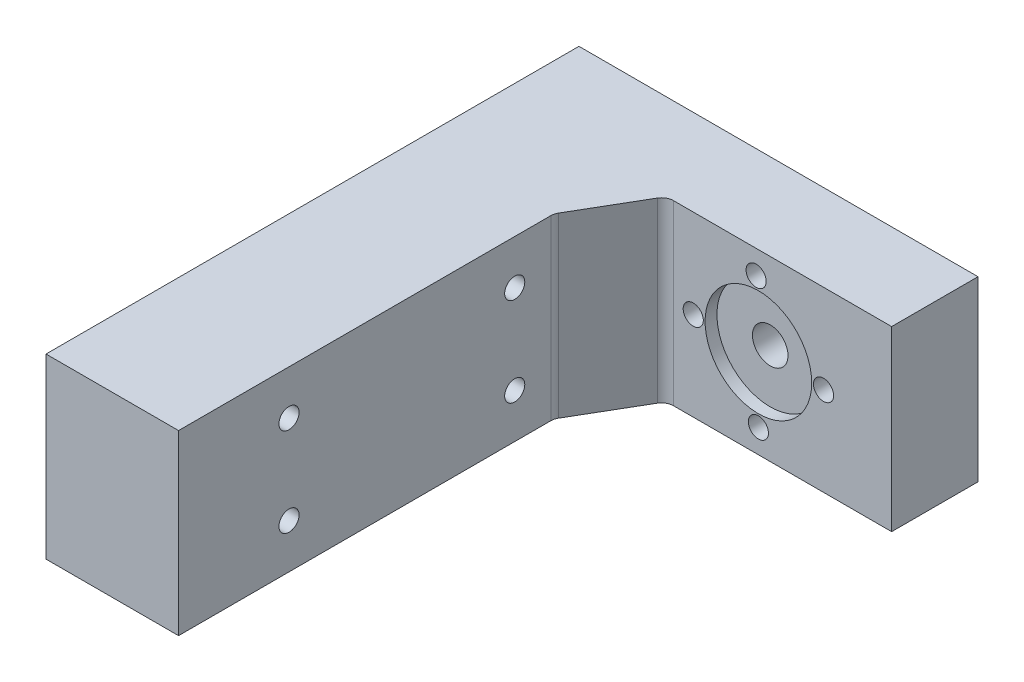
ISO-10303-21;
HEADER;
FILE_DESCRIPTION(('STEP AP214'),'2;1');
FILE_NAME('part.step','',(''),(''),'','','');
FILE_SCHEMA(('AUTOMOTIVE_DESIGN { 1 0 10303 214 1 1 1 1 }'));
ENDSEC;
DATA;
#1=APPLICATION_CONTEXT('core data for automotive mechanical design processes');
#2=APPLICATION_PROTOCOL_DEFINITION('international standard','automotive_design',2000,#1);
#3=PRODUCT_CONTEXT('',#1,'mechanical');
#4=PRODUCT('Part','Part','',(#3));
#5=PRODUCT_RELATED_PRODUCT_CATEGORY('part','',(#4));
#6=PRODUCT_DEFINITION_FORMATION('','',#4);
#7=PRODUCT_DEFINITION_CONTEXT('part definition',#1,'design');
#8=PRODUCT_DEFINITION('design','',#6,#7);
#9=PRODUCT_DEFINITION_SHAPE('','',#8);
#10=(LENGTH_UNIT() NAMED_UNIT(*) SI_UNIT(.MILLI.,.METRE.));
#11=(NAMED_UNIT(*) PLANE_ANGLE_UNIT() SI_UNIT($,.RADIAN.));
#12=(NAMED_UNIT(*) SI_UNIT($,.STERADIAN.) SOLID_ANGLE_UNIT());
#13=UNCERTAINTY_MEASURE_WITH_UNIT(LENGTH_MEASURE(1.E-05),#10,'distance_accuracy_value','');
#14=(GEOMETRIC_REPRESENTATION_CONTEXT(3) GLOBAL_UNCERTAINTY_ASSIGNED_CONTEXT((#13)) GLOBAL_UNIT_ASSIGNED_CONTEXT((#10,
#11,#12)) REPRESENTATION_CONTEXT('',''));
#15=CARTESIAN_POINT('',(0.,0.,0.));
#16=DIRECTION('',(0.,0.,1.));
#17=DIRECTION('',(1.,0.,0.));
#18=AXIS2_PLACEMENT_3D('',#15,#16,#17);
#19=CARTESIAN_POINT('',(-225.,150.,0.));
#20=DIRECTION('',(0.,0.,1.));
#21=DIRECTION('',(1.,0.,0.));
#22=AXIS2_PLACEMENT_3D('',#19,#20,#21);
#23=CYLINDRICAL_SURFACE('',#22,30.);
#24=CARTESIAN_POINT('',(-225.,150.,0.));
#25=DIRECTION('',(0.,0.,1.));
#26=DIRECTION('',(1.,0.,0.));
#27=AXIS2_PLACEMENT_3D('',#24,#25,#26);
#28=CIRCLE('',#27,30.);
#29=CARTESIAN_POINT('',(-195.,150.,0.));
#30=VERTEX_POINT('',#29);
#31=EDGE_CURVE('E231',#30,#30,#28,.T.);
#32=ORIENTED_EDGE('',*,*,#31,.F.);
#33=EDGE_LOOP('',(#32));
#34=FACE_BOUND('',#33,.T.);
#35=CARTESIAN_POINT('',(-225.,150.,125.843324446959));
#36=DIRECTION('',(0.,0.,1.));
#37=DIRECTION('',(1.,0.,0.));
#38=AXIS2_PLACEMENT_3D('',#35,#36,#37);
#39=CIRCLE('',#38,30.);
#40=CARTESIAN_POINT('',(-195.,150.,125.843324446959));
#41=VERTEX_POINT('',#40);
#42=EDGE_CURVE('E229',#41,#41,#39,.F.);
#43=ORIENTED_EDGE('',*,*,#42,.F.);
#44=EDGE_LOOP('',(#43));
#45=FACE_BOUND('',#44,.T.);
#46=ADVANCED_FACE('F119',(#34,#45),#23,.F.);
#47=CARTESIAN_POINT('',(0.,300.,145.843324446959));
#48=DIRECTION('',(-1.,0.,0.));
#49=DIRECTION('',(0.,0.,1.));
#50=AXIS2_PLACEMENT_3D('',#47,#48,#49);
#51=PLANE('',#50);
#52=DIRECTION('',(0.,0.,-1.));
#53=VECTOR('',#52,1.);
#54=CARTESIAN_POINT('',(0.,0.,145.843324446959));
#55=LINE('',#54,#53);
#56=CARTESIAN_POINT('',(0.,0.,145.843324446959));
#57=VERTEX_POINT('',#56);
#58=CARTESIAN_POINT('',(0.,0.,0.));
#59=VERTEX_POINT('',#58);
#60=EDGE_CURVE('E219',#57,#59,#55,.T.);
#61=ORIENTED_EDGE('',*,*,#60,.T.);
#62=DIRECTION('',(0.,-1.,0.));
#63=VECTOR('',#62,1.);
#64=CARTESIAN_POINT('',(0.,300.,0.));
#65=LINE('',#64,#63);
#66=CARTESIAN_POINT('',(0.,300.,0.));
#67=VERTEX_POINT('',#66);
#68=EDGE_CURVE('E196',#67,#59,#65,.T.);
#69=ORIENTED_EDGE('',*,*,#68,.F.);
#70=DIRECTION('',(0.,0.,-1.));
#71=VECTOR('',#70,1.);
#72=CARTESIAN_POINT('',(0.,300.,145.843324446959));
#73=LINE('',#72,#71);
#74=CARTESIAN_POINT('',(0.,300.,145.843324446959));
#75=VERTEX_POINT('',#74);
#76=EDGE_CURVE('E203',#75,#67,#73,.T.);
#77=ORIENTED_EDGE('',*,*,#76,.F.);
#78=DIRECTION('',(0.,-1.,0.));
#79=VECTOR('',#78,1.);
#80=CARTESIAN_POINT('',(0.,300.,145.843324446959));
#81=LINE('',#80,#79);
#82=EDGE_CURVE('E283',#75,#57,#81,.T.);
#83=ORIENTED_EDGE('',*,*,#82,.T.);
#84=EDGE_LOOP('',(#61,#69,#77,#83));
#85=FACE_BOUND('',#84,.T.);
#86=ADVANCED_FACE('F216',(#85),#51,.F.);
#87=CARTESIAN_POINT('',(0.,300.,0.));
#88=DIRECTION('',(0.,0.,1.));
#89=DIRECTION('',(1.,0.,0.));
#90=AXIS2_PLACEMENT_3D('',#87,#88,#89);
#91=PLANE('',#90);
#92=CARTESIAN_POINT('',(-335.,150.,0.));
#93=DIRECTION('',(0.,0.,1.));
#94=DIRECTION('',(1.,0.,0.));
#95=AXIS2_PLACEMENT_3D('',#92,#93,#94);
#96=CIRCLE('',#95,17.);
#97=CARTESIAN_POINT('',(-318.,150.,0.));
#98=VERTEX_POINT('',#97);
#99=EDGE_CURVE('E304',#98,#98,#96,.T.);
#100=ORIENTED_EDGE('',*,*,#99,.T.);
#101=EDGE_LOOP('',(#100));
#102=FACE_BOUND('',#101,.T.);
#103=ORIENTED_EDGE('',*,*,#31,.T.);
#104=EDGE_LOOP('',(#103));
#105=FACE_BOUND('',#104,.T.);
#106=CARTESIAN_POINT('',(-225.,40.,0.));
#107=DIRECTION('',(0.,0.,1.));
#108=DIRECTION('',(1.,0.,0.));
#109=AXIS2_PLACEMENT_3D('',#106,#107,#108);
#110=CIRCLE('',#109,17.);
#111=CARTESIAN_POINT('',(-208.,40.,0.));
#112=VERTEX_POINT('',#111);
#113=EDGE_CURVE('E332',#112,#112,#110,.T.);
#114=ORIENTED_EDGE('',*,*,#113,.T.);
#115=EDGE_LOOP('',(#114));
#116=FACE_BOUND('',#115,.T.);
#117=CARTESIAN_POINT('',(-115.,150.,0.));
#118=DIRECTION('',(0.,0.,1.));
#119=DIRECTION('',(1.,0.,0.));
#120=AXIS2_PLACEMENT_3D('',#117,#118,#119);
#121=CIRCLE('',#120,17.);
#122=CARTESIAN_POINT('',(-98.,150.,0.));
#123=VERTEX_POINT('',#122);
#124=EDGE_CURVE('E313',#123,#123,#121,.T.);
#125=ORIENTED_EDGE('',*,*,#124,.T.);
#126=EDGE_LOOP('',(#125));
#127=FACE_BOUND('',#126,.T.);
#128=CARTESIAN_POINT('',(-228.822978678295,259.933547354869,0.));
#129=DIRECTION('',(0.,0.,1.));
#130=DIRECTION('',(1.,0.,0.));
#131=AXIS2_PLACEMENT_3D('',#128,#129,#130);
#132=CIRCLE('',#131,17.);
#133=CARTESIAN_POINT('',(-211.822978678295,259.933547354869,0.));
#134=VERTEX_POINT('',#133);
#135=EDGE_CURVE('E324',#134,#134,#132,.T.);
#136=ORIENTED_EDGE('',*,*,#135,.T.);
#137=EDGE_LOOP('',(#136));
#138=FACE_BOUND('',#137,.T.);
#139=DIRECTION('',(-1.,0.,0.));
#140=VECTOR('',#139,1.);
#141=CARTESIAN_POINT('',(0.,0.,0.));
#142=LINE('',#141,#140);
#143=CARTESIAN_POINT('',(-673.85334867981,0.,0.));
#144=VERTEX_POINT('',#143);
#145=EDGE_CURVE('E296',#59,#144,#142,.T.);
#146=ORIENTED_EDGE('',*,*,#145,.T.);
#147=DIRECTION('',(0.,-1.,0.));
#148=VECTOR('',#147,1.);
#149=CARTESIAN_POINT('',(-673.85334867981,300.,0.));
#150=LINE('',#149,#148);
#151=CARTESIAN_POINT('',(-673.85334867981,300.,0.));
#152=VERTEX_POINT('',#151);
#153=EDGE_CURVE('E198',#152,#144,#150,.T.);
#154=ORIENTED_EDGE('',*,*,#153,.F.);
#155=DIRECTION('',(-1.,0.,0.));
#156=VECTOR('',#155,1.);
#157=CARTESIAN_POINT('',(0.,300.,0.));
#158=LINE('',#157,#156);
#159=EDGE_CURVE('E195',#67,#152,#158,.T.);
#160=ORIENTED_EDGE('',*,*,#159,.F.);
#161=ORIENTED_EDGE('',*,*,#68,.T.);
#162=EDGE_LOOP('',(#146,#154,#160,#161));
#163=FACE_BOUND('',#162,.T.);
#164=ADVANCED_FACE('F191',(#102,#105,#116,#127,#138,#163),#91,.F.);
#165=CARTESIAN_POINT('',(-673.85334867981,300.,0.));
#166=DIRECTION('',(1.,0.,0.));
#167=DIRECTION('',(0.,0.,-1.));
#168=AXIS2_PLACEMENT_3D('',#165,#166,#167);
#169=PLANE('',#168);
#170=CARTESIAN_POINT('',(-673.85334867981,225.,713.5));
#171=DIRECTION('',(1.,0.,0.));
#172=DIRECTION('',(0.,0.,-1.));
#173=AXIS2_PLACEMENT_3D('',#170,#171,#172);
#174=CIRCLE('',#173,17.);
#175=CARTESIAN_POINT('',(-673.85334867981,225.,696.5));
#176=VERTEX_POINT('',#175);
#177=EDGE_CURVE('E373',#176,#176,#174,.T.);
#178=ORIENTED_EDGE('',*,*,#177,.T.);
#179=EDGE_LOOP('',(#178));
#180=FACE_BOUND('',#179,.T.);
#181=CARTESIAN_POINT('',(-673.85334867981,75.,332.343324446959));
#182=DIRECTION('',(1.,0.,0.));
#183=DIRECTION('',(0.,0.,-1.));
#184=AXIS2_PLACEMENT_3D('',#181,#182,#183);
#185=CIRCLE('',#184,17.);
#186=CARTESIAN_POINT('',(-673.85334867981,75.,315.343324446959));
#187=VERTEX_POINT('',#186);
#188=EDGE_CURVE('E364',#187,#187,#185,.T.);
#189=ORIENTED_EDGE('',*,*,#188,.T.);
#190=EDGE_LOOP('',(#189));
#191=FACE_BOUND('',#190,.T.);
#192=CARTESIAN_POINT('',(-673.85334867981,225.,332.343324446959));
#193=DIRECTION('',(1.,0.,0.));
#194=DIRECTION('',(0.,0.,-1.));
#195=AXIS2_PLACEMENT_3D('',#192,#193,#194);
#196=CIRCLE('',#195,17.);
#197=CARTESIAN_POINT('',(-673.85334867981,225.,315.343324446959));
#198=VERTEX_POINT('',#197);
#199=EDGE_CURVE('E379',#198,#198,#196,.T.);
#200=ORIENTED_EDGE('',*,*,#199,.T.);
#201=EDGE_LOOP('',(#200));
#202=FACE_BOUND('',#201,.T.);
#203=CARTESIAN_POINT('',(-673.85334867981,75.,713.5));
#204=DIRECTION('',(1.,0.,0.));
#205=DIRECTION('',(0.,0.,-1.));
#206=AXIS2_PLACEMENT_3D('',#203,#204,#205);
#207=CIRCLE('',#206,17.);
#208=CARTESIAN_POINT('',(-673.85334867981,75.,696.5));
#209=VERTEX_POINT('',#208);
#210=EDGE_CURVE('E351',#209,#209,#207,.T.);
#211=ORIENTED_EDGE('',*,*,#210,.T.);
#212=EDGE_LOOP('',(#211));
#213=FACE_BOUND('',#212,.T.);
#214=DIRECTION('',(0.,0.,1.));
#215=VECTOR('',#214,1.);
#216=CARTESIAN_POINT('',(-673.85334867981,0.,0.));
#217=LINE('',#216,#215);
#218=CARTESIAN_POINT('',(-673.85334867981,0.,900.));
#219=VERTEX_POINT('',#218);
#220=EDGE_CURVE('E278',#144,#219,#217,.T.);
#221=ORIENTED_EDGE('',*,*,#220,.T.);
#222=DIRECTION('',(0.,-1.,0.));
#223=VECTOR('',#222,1.);
#224=CARTESIAN_POINT('',(-673.85334867981,300.,900.));
#225=LINE('',#224,#223);
#226=CARTESIAN_POINT('',(-673.85334867981,300.,900.));
#227=VERTEX_POINT('',#226);
#228=EDGE_CURVE('E228',#227,#219,#225,.T.);
#229=ORIENTED_EDGE('',*,*,#228,.F.);
#230=DIRECTION('',(0.,0.,1.));
#231=VECTOR('',#230,1.);
#232=CARTESIAN_POINT('',(-673.85334867981,300.,0.));
#233=LINE('',#232,#231);
#234=EDGE_CURVE('E205',#152,#227,#233,.T.);
#235=ORIENTED_EDGE('',*,*,#234,.F.);
#236=ORIENTED_EDGE('',*,*,#153,.T.);
#237=EDGE_LOOP('',(#221,#229,#235,#236));
#238=FACE_BOUND('',#237,.T.);
#239=ADVANCED_FACE('F449',(#180,#191,#202,#213,#238),#169,.F.);
#240=CARTESIAN_POINT('',(-673.85334867981,300.,900.));
#241=DIRECTION('',(0.,0.,-1.));
#242=DIRECTION('',(-1.,0.,0.));
#243=AXIS2_PLACEMENT_3D('',#240,#241,#242);
#244=PLANE('',#243);
#245=DIRECTION('',(1.,0.,0.));
#246=VECTOR('',#245,1.);
#247=CARTESIAN_POINT('',(-673.85334867981,0.,900.));
#248=LINE('',#247,#246);
#249=CARTESIAN_POINT('',(-450.,0.,900.));
#250=VERTEX_POINT('',#249);
#251=EDGE_CURVE('E273',#219,#250,#248,.T.);
#252=ORIENTED_EDGE('',*,*,#251,.T.);
#253=DIRECTION('',(0.,-1.,0.));
#254=VECTOR('',#253,1.);
#255=CARTESIAN_POINT('',(-450.,300.,900.));
#256=LINE('',#255,#254);
#257=CARTESIAN_POINT('',(-450.,300.,900.));
#258=VERTEX_POINT('',#257);
#259=EDGE_CURVE('E275',#258,#250,#256,.T.);
#260=ORIENTED_EDGE('',*,*,#259,.F.);
#261=DIRECTION('',(1.,0.,0.));
#262=VECTOR('',#261,1.);
#263=CARTESIAN_POINT('',(-673.85334867981,300.,900.));
#264=LINE('',#263,#262);
#265=EDGE_CURVE('E295',#227,#258,#264,.T.);
#266=ORIENTED_EDGE('',*,*,#265,.F.);
#267=ORIENTED_EDGE('',*,*,#228,.T.);
#268=EDGE_LOOP('',(#252,#260,#266,#267));
#269=FACE_BOUND('',#268,.T.);
#270=ADVANCED_FACE('F291',(#269),#244,.F.);
#271=CARTESIAN_POINT('',(-450.,300.,900.));
#272=DIRECTION('',(-1.,0.,0.));
#273=DIRECTION('',(0.,0.,1.));
#274=AXIS2_PLACEMENT_3D('',#271,#272,#273);
#275=PLANE('',#274);
#276=CARTESIAN_POINT('',(-450.,225.,713.5));
#277=DIRECTION('',(1.,0.,0.));
#278=DIRECTION('',(0.,0.,-1.));
#279=AXIS2_PLACEMENT_3D('',#276,#277,#278);
#280=CIRCLE('',#279,17.);
#281=CARTESIAN_POINT('',(-450.,225.,696.5));
#282=VERTEX_POINT('',#281);
#283=EDGE_CURVE('E359',#282,#282,#280,.T.);
#284=ORIENTED_EDGE('',*,*,#283,.F.);
#285=EDGE_LOOP('',(#284));
#286=FACE_BOUND('',#285,.T.);
#287=CARTESIAN_POINT('',(-450.,75.,332.343324446959));
#288=DIRECTION('',(1.,0.,0.));
#289=DIRECTION('',(0.,0.,-1.));
#290=AXIS2_PLACEMENT_3D('',#287,#288,#289);
#291=CIRCLE('',#290,17.);
#292=CARTESIAN_POINT('',(-450.,75.,315.343324446959));
#293=VERTEX_POINT('',#292);
#294=EDGE_CURVE('E368',#293,#293,#291,.T.);
#295=ORIENTED_EDGE('',*,*,#294,.F.);
#296=EDGE_LOOP('',(#295));
#297=FACE_BOUND('',#296,.T.);
#298=CARTESIAN_POINT('',(-450.,225.,332.343324446959));
#299=DIRECTION('',(1.,0.,0.));
#300=DIRECTION('',(0.,0.,-1.));
#301=AXIS2_PLACEMENT_3D('',#298,#299,#300);
#302=CIRCLE('',#301,17.);
#303=CARTESIAN_POINT('',(-450.,225.,315.343324446959));
#304=VERTEX_POINT('',#303);
#305=EDGE_CURVE('E367',#304,#304,#302,.T.);
#306=ORIENTED_EDGE('',*,*,#305,.F.);
#307=EDGE_LOOP('',(#306));
#308=FACE_BOUND('',#307,.T.);
#309=CARTESIAN_POINT('',(-450.,75.,713.5));
#310=DIRECTION('',(1.,0.,0.));
#311=DIRECTION('',(0.,0.,-1.));
#312=AXIS2_PLACEMENT_3D('',#309,#310,#311);
#313=CIRCLE('',#312,17.);
#314=CARTESIAN_POINT('',(-450.,75.,696.5));
#315=VERTEX_POINT('',#314);
#316=EDGE_CURVE('E358',#315,#315,#313,.T.);
#317=ORIENTED_EDGE('',*,*,#316,.F.);
#318=EDGE_LOOP('',(#317));
#319=FACE_BOUND('',#318,.T.);
#320=DIRECTION('',(0.,0.,-1.));
#321=VECTOR('',#320,1.);
#322=CARTESIAN_POINT('',(-450.,0.,900.));
#323=LINE('',#322,#321);
#324=CARTESIAN_POINT('',(-450.,0.,271.250307273959));
#325=VERTEX_POINT('',#324);
#326=EDGE_CURVE('E267',#250,#325,#323,.T.);
#327=ORIENTED_EDGE('',*,*,#326,.T.);
#328=DIRECTION('',(0.,-1.,0.));
#329=VECTOR('',#328,1.);
#330=CARTESIAN_POINT('',(-450.,300.,271.250307273959));
#331=LINE('',#330,#329);
#332=CARTESIAN_POINT('',(-450.,300.,271.250307273959));
#333=VERTEX_POINT('',#332);
#334=EDGE_CURVE('E248',#325,#333,#331,.F.);
#335=ORIENTED_EDGE('',*,*,#334,.T.);
#336=DIRECTION('',(0.,0.,-1.));
#337=VECTOR('',#336,1.);
#338=CARTESIAN_POINT('',(-450.,300.,900.));
#339=LINE('',#338,#337);
#340=EDGE_CURVE('E262',#258,#333,#339,.T.);
#341=ORIENTED_EDGE('',*,*,#340,.F.);
#342=ORIENTED_EDGE('',*,*,#259,.T.);
#343=EDGE_LOOP('',(#327,#335,#341,#342));
#344=FACE_BOUND('',#343,.T.);
#345=ADVANCED_FACE('F270',(#286,#297,#308,#319,#344),#275,.F.);
#346=CARTESIAN_POINT('',(-450.,300.,145.843324446959));
#347=DIRECTION('',(0.,0.,-1.));
#348=DIRECTION('',(-1.,0.,0.));
#349=AXIS2_PLACEMENT_3D('',#346,#347,#348);
#350=PLANE('',#349);
#351=CARTESIAN_POINT('',(-225.,150.,145.843324446959));
#352=DIRECTION('',(0.,0.,1.));
#353=DIRECTION('',(1.,0.,0.));
#354=AXIS2_PLACEMENT_3D('',#351,#352,#353);
#355=CIRCLE('',#354,90.);
#356=CARTESIAN_POINT('',(-135.,150.,145.843324446959));
#357=VERTEX_POINT('',#356);
#358=EDGE_CURVE('E349',#357,#357,#355,.T.);
#359=ORIENTED_EDGE('',*,*,#358,.F.);
#360=EDGE_LOOP('',(#359));
#361=FACE_BOUND('',#360,.T.);
#362=CARTESIAN_POINT('',(-335.,150.,145.843324446959));
#363=DIRECTION('',(0.,0.,1.));
#364=DIRECTION('',(1.,0.,0.));
#365=AXIS2_PLACEMENT_3D('',#362,#363,#364);
#366=CIRCLE('',#365,17.);
#367=CARTESIAN_POINT('',(-318.,150.,145.843324446959));
#368=VERTEX_POINT('',#367);
#369=EDGE_CURVE('E334',#368,#368,#366,.T.);
#370=ORIENTED_EDGE('',*,*,#369,.F.);
#371=EDGE_LOOP('',(#370));
#372=FACE_BOUND('',#371,.T.);
#373=CARTESIAN_POINT('',(-225.,40.,145.843324446959));
#374=DIRECTION('',(0.,0.,1.));
#375=DIRECTION('',(1.,0.,0.));
#376=AXIS2_PLACEMENT_3D('',#373,#374,#375);
#377=CIRCLE('',#376,17.);
#378=CARTESIAN_POINT('',(-208.,40.,145.843324446959));
#379=VERTEX_POINT('',#378);
#380=EDGE_CURVE('E316',#379,#379,#377,.T.);
#381=ORIENTED_EDGE('',*,*,#380,.F.);
#382=EDGE_LOOP('',(#381));
#383=FACE_BOUND('',#382,.T.);
#384=CARTESIAN_POINT('',(-115.,150.,145.843324446959));
#385=DIRECTION('',(0.,0.,1.));
#386=DIRECTION('',(1.,0.,0.));
#387=AXIS2_PLACEMENT_3D('',#384,#385,#386);
#388=CIRCLE('',#387,17.);
#389=CARTESIAN_POINT('',(-98.,150.,145.843324446959));
#390=VERTEX_POINT('',#389);
#391=EDGE_CURVE('E319',#390,#390,#388,.T.);
#392=ORIENTED_EDGE('',*,*,#391,.F.);
#393=EDGE_LOOP('',(#392));
#394=FACE_BOUND('',#393,.T.);
#395=CARTESIAN_POINT('',(-228.822978678295,259.933547354869,145.843324446959));
#396=DIRECTION('',(0.,0.,1.));
#397=DIRECTION('',(1.,0.,0.));
#398=AXIS2_PLACEMENT_3D('',#395,#396,#397);
#399=CIRCLE('',#398,17.);
#400=CARTESIAN_POINT('',(-211.822978678295,259.933547354869,145.843324446959));
#401=VERTEX_POINT('',#400);
#402=EDGE_CURVE('E327',#401,#401,#399,.T.);
#403=ORIENTED_EDGE('',*,*,#402,.F.);
#404=EDGE_LOOP('',(#403));
#405=FACE_BOUND('',#404,.T.);
#406=DIRECTION('',(1.,0.,0.));
#407=VECTOR('',#406,1.);
#408=CARTESIAN_POINT('',(-450.,300.,145.843324446959));
#409=LINE('',#408,#407);
#410=CARTESIAN_POINT('',(-368.512593350917,300.,145.843324446959));
#411=VERTEX_POINT('',#410);
#412=EDGE_CURVE('E209',#411,#75,#409,.T.);
#413=ORIENTED_EDGE('',*,*,#412,.F.);
#414=DIRECTION('',(0.,1.,0.));
#415=VECTOR('',#414,1.);
#416=CARTESIAN_POINT('',(-368.512593350917,1.11022302462516E-13,145.843324446959));
#417=LINE('',#416,#415);
#418=CARTESIAN_POINT('',(-368.512593350917,0.,145.843324446959));
#419=VERTEX_POINT('',#418);
#420=EDGE_CURVE('E237',#411,#419,#417,.F.);
#421=ORIENTED_EDGE('',*,*,#420,.T.);
#422=DIRECTION('',(1.,0.,0.));
#423=VECTOR('',#422,1.);
#424=CARTESIAN_POINT('',(-450.,0.,145.843324446959));
#425=LINE('',#424,#423);
#426=EDGE_CURVE('E211',#419,#57,#425,.T.);
#427=ORIENTED_EDGE('',*,*,#426,.T.);
#428=ORIENTED_EDGE('',*,*,#82,.F.);
#429=EDGE_LOOP('',(#413,#421,#427,#428));
#430=FACE_BOUND('',#429,.T.);
#431=ADVANCED_FACE('F392',(#361,#372,#383,#394,#405,#430),#350,.F.);
#432=CARTESIAN_POINT('',(0.,300.,0.));
#433=DIRECTION('',(0.,1.,0.));
#434=DIRECTION('',(0.,0.,1.));
#435=AXIS2_PLACEMENT_3D('',#432,#433,#434);
#436=PLANE('',#435);
#437=ORIENTED_EDGE('',*,*,#76,.T.);
#438=ORIENTED_EDGE('',*,*,#159,.T.);
#439=ORIENTED_EDGE('',*,*,#234,.T.);
#440=ORIENTED_EDGE('',*,*,#265,.T.);
#441=ORIENTED_EDGE('',*,*,#340,.T.);
#442=CARTESIAN_POINT('',(-430.,300.,271.250307273959));
#443=DIRECTION('',(0.,1.,0.));
#444=DIRECTION('',(0.,0.,1.));
#445=AXIS2_PLACEMENT_3D('',#442,#443,#444);
#446=CIRCLE('',#445,20.);
#447=CARTESIAN_POINT('',(-447.275578017969,300.,261.172886763477));
#448=VERTEX_POINT('',#447);
#449=EDGE_CURVE('E126',#333,#448,#446,.F.);
#450=ORIENTED_EDGE('',*,*,#449,.T.);
#451=DIRECTION('',(-0.503871025524086,0.,0.863778900898433));
#452=VECTOR('',#451,1.);
#453=CARTESIAN_POINT('',(-380.,300.,145.843324446959));
#454=LINE('',#453,#452);
#455=CARTESIAN_POINT('',(-385.788171368886,300.,155.765903936478));
#456=VERTEX_POINT('',#455);
#457=EDGE_CURVE('E223',#448,#456,#454,.F.);
#458=ORIENTED_EDGE('',*,*,#457,.T.);
#459=CARTESIAN_POINT('',(-368.512593350917,300.,165.843324446959));
#460=DIRECTION('',(0.,1.,0.));
#461=DIRECTION('',(0.,0.,1.));
#462=AXIS2_PLACEMENT_3D('',#459,#460,#461);
#463=CIRCLE('',#462,20.);
#464=EDGE_CURVE('E253',#456,#411,#463,.F.);
#465=ORIENTED_EDGE('',*,*,#464,.T.);
#466=ORIENTED_EDGE('',*,*,#412,.T.);
#467=EDGE_LOOP('',(#437,#438,#439,#440,#441,#450,#458,#465,#466));
#468=FACE_BOUND('',#467,.T.);
#469=ADVANCED_FACE('F210',(#468),#436,.T.);
#470=CARTESIAN_POINT('',(0.,0.,0.));
#471=DIRECTION('',(0.,1.,0.));
#472=DIRECTION('',(0.,0.,1.));
#473=AXIS2_PLACEMENT_3D('',#470,#471,#472);
#474=PLANE('',#473);
#475=ORIENTED_EDGE('',*,*,#60,.F.);
#476=ORIENTED_EDGE('',*,*,#426,.F.);
#477=CARTESIAN_POINT('',(-368.512593350917,0.,165.843324446959));
#478=DIRECTION('',(0.,1.,0.));
#479=DIRECTION('',(0.,0.,1.));
#480=AXIS2_PLACEMENT_3D('',#477,#478,#479);
#481=CIRCLE('',#480,20.);
#482=CARTESIAN_POINT('',(-385.788171368886,0.,155.765903936478));
#483=VERTEX_POINT('',#482);
#484=EDGE_CURVE('E255',#419,#483,#481,.T.);
#485=ORIENTED_EDGE('',*,*,#484,.T.);
#486=DIRECTION('',(0.503871025524086,0.,-0.863778900898433));
#487=VECTOR('',#486,1.);
#488=CARTESIAN_POINT('',(-220.047465007541,0.,-128.361021254399));
#489=LINE('',#488,#487);
#490=CARTESIAN_POINT('',(-447.275578017969,0.,261.172886763477));
#491=VERTEX_POINT('',#490);
#492=EDGE_CURVE('E220',#483,#491,#489,.F.);
#493=ORIENTED_EDGE('',*,*,#492,.T.);
#494=CARTESIAN_POINT('',(-430.,0.,271.250307273959));
#495=DIRECTION('',(0.,1.,0.));
#496=DIRECTION('',(0.,0.,1.));
#497=AXIS2_PLACEMENT_3D('',#494,#495,#496);
#498=CIRCLE('',#497,20.);
#499=EDGE_CURVE('E14',#491,#325,#498,.T.);
#500=ORIENTED_EDGE('',*,*,#499,.T.);
#501=ORIENTED_EDGE('',*,*,#326,.F.);
#502=ORIENTED_EDGE('',*,*,#251,.F.);
#503=ORIENTED_EDGE('',*,*,#220,.F.);
#504=ORIENTED_EDGE('',*,*,#145,.F.);
#505=EDGE_LOOP('',(#475,#476,#485,#493,#500,#501,#502,#503,#504));
#506=FACE_BOUND('',#505,.T.);
#507=ADVANCED_FACE('F300',(#506),#474,.F.);
#508=CARTESIAN_POINT('',(-228.822978678295,259.933547354869,0.));
#509=DIRECTION('',(0.,0.,1.));
#510=DIRECTION('',(1.,0.,0.));
#511=AXIS2_PLACEMENT_3D('',#508,#509,#510);
#512=CYLINDRICAL_SURFACE('',#511,17.);
#513=ORIENTED_EDGE('',*,*,#135,.F.);
#514=EDGE_LOOP('',(#513));
#515=FACE_BOUND('',#514,.T.);
#516=ORIENTED_EDGE('',*,*,#402,.T.);
#517=EDGE_LOOP('',(#516));
#518=FACE_BOUND('',#517,.T.);
#519=ADVANCED_FACE('F431',(#515,#518),#512,.F.);
#520=CARTESIAN_POINT('',(-115.,150.,0.));
#521=DIRECTION('',(0.,0.,1.));
#522=DIRECTION('',(1.,0.,0.));
#523=AXIS2_PLACEMENT_3D('',#520,#521,#522);
#524=CYLINDRICAL_SURFACE('',#523,17.);
#525=ORIENTED_EDGE('',*,*,#124,.F.);
#526=EDGE_LOOP('',(#525));
#527=FACE_BOUND('',#526,.T.);
#528=ORIENTED_EDGE('',*,*,#391,.T.);
#529=EDGE_LOOP('',(#528));
#530=FACE_BOUND('',#529,.T.);
#531=ADVANCED_FACE('F432',(#527,#530),#524,.F.);
#532=CARTESIAN_POINT('',(-225.,40.,0.));
#533=DIRECTION('',(0.,0.,1.));
#534=DIRECTION('',(1.,0.,0.));
#535=AXIS2_PLACEMENT_3D('',#532,#533,#534);
#536=CYLINDRICAL_SURFACE('',#535,17.);
#537=ORIENTED_EDGE('',*,*,#113,.F.);
#538=EDGE_LOOP('',(#537));
#539=FACE_BOUND('',#538,.T.);
#540=ORIENTED_EDGE('',*,*,#380,.T.);
#541=EDGE_LOOP('',(#540));
#542=FACE_BOUND('',#541,.T.);
#543=ADVANCED_FACE('F429',(#539,#542),#536,.F.);
#544=CARTESIAN_POINT('',(-335.,150.,0.));
#545=DIRECTION('',(0.,0.,1.));
#546=DIRECTION('',(1.,0.,0.));
#547=AXIS2_PLACEMENT_3D('',#544,#545,#546);
#548=CYLINDRICAL_SURFACE('',#547,17.);
#549=ORIENTED_EDGE('',*,*,#99,.F.);
#550=EDGE_LOOP('',(#549));
#551=FACE_BOUND('',#550,.T.);
#552=ORIENTED_EDGE('',*,*,#369,.T.);
#553=EDGE_LOOP('',(#552));
#554=FACE_BOUND('',#553,.T.);
#555=ADVANCED_FACE('F522',(#551,#554),#548,.F.);
#556=CARTESIAN_POINT('',(-225.,150.,125.843324446959));
#557=DIRECTION('',(0.,0.,1.));
#558=DIRECTION('',(1.,0.,0.));
#559=AXIS2_PLACEMENT_3D('',#556,#557,#558);
#560=PLANE('',#559);
#561=CARTESIAN_POINT('',(-225.,150.,125.843324446959));
#562=DIRECTION('',(0.,0.,1.));
#563=DIRECTION('',(1.,0.,0.));
#564=AXIS2_PLACEMENT_3D('',#561,#562,#563);
#565=CIRCLE('',#564,90.);
#566=CARTESIAN_POINT('',(-135.,150.,125.843324446959));
#567=VERTEX_POINT('',#566);
#568=EDGE_CURVE('E234',#567,#567,#565,.T.);
#569=ORIENTED_EDGE('',*,*,#568,.T.);
#570=EDGE_LOOP('',(#569));
#571=FACE_BOUND('',#570,.T.);
#572=ORIENTED_EDGE('',*,*,#42,.T.);
#573=EDGE_LOOP('',(#572));
#574=FACE_BOUND('',#573,.T.);
#575=ADVANCED_FACE('F408',(#571,#574),#560,.T.);
#576=CARTESIAN_POINT('',(-225.,150.,125.843324446959));
#577=DIRECTION('',(0.,0.,1.));
#578=DIRECTION('',(1.,0.,0.));
#579=AXIS2_PLACEMENT_3D('',#576,#577,#578);
#580=CYLINDRICAL_SURFACE('',#579,90.);
#581=ORIENTED_EDGE('',*,*,#568,.F.);
#582=EDGE_LOOP('',(#581));
#583=FACE_BOUND('',#582,.T.);
#584=ORIENTED_EDGE('',*,*,#358,.T.);
#585=EDGE_LOOP('',(#584));
#586=FACE_BOUND('',#585,.T.);
#587=ADVANCED_FACE('F398',(#583,#586),#580,.F.);
#588=CARTESIAN_POINT('',(-673.85334867981,75.,713.5));
#589=DIRECTION('',(1.,0.,0.));
#590=DIRECTION('',(0.,0.,-1.));
#591=AXIS2_PLACEMENT_3D('',#588,#589,#590);
#592=CYLINDRICAL_SURFACE('',#591,17.);
#593=ORIENTED_EDGE('',*,*,#210,.F.);
#594=EDGE_LOOP('',(#593));
#595=FACE_BOUND('',#594,.T.);
#596=ORIENTED_EDGE('',*,*,#316,.T.);
#597=EDGE_LOOP('',(#596));
#598=FACE_BOUND('',#597,.T.);
#599=ADVANCED_FACE('F396',(#595,#598),#592,.F.);
#600=CARTESIAN_POINT('',(-673.85334867981,225.,332.343324446959));
#601=DIRECTION('',(1.,0.,0.));
#602=DIRECTION('',(0.,0.,-1.));
#603=AXIS2_PLACEMENT_3D('',#600,#601,#602);
#604=CYLINDRICAL_SURFACE('',#603,17.);
#605=ORIENTED_EDGE('',*,*,#199,.F.);
#606=EDGE_LOOP('',(#605));
#607=FACE_BOUND('',#606,.T.);
#608=ORIENTED_EDGE('',*,*,#305,.T.);
#609=EDGE_LOOP('',(#608));
#610=FACE_BOUND('',#609,.T.);
#611=ADVANCED_FACE('F389',(#607,#610),#604,.F.);
#612=CARTESIAN_POINT('',(-673.85334867981,75.,332.343324446959));
#613=DIRECTION('',(1.,0.,0.));
#614=DIRECTION('',(0.,0.,-1.));
#615=AXIS2_PLACEMENT_3D('',#612,#613,#614);
#616=CYLINDRICAL_SURFACE('',#615,17.);
#617=ORIENTED_EDGE('',*,*,#188,.F.);
#618=EDGE_LOOP('',(#617));
#619=FACE_BOUND('',#618,.T.);
#620=ORIENTED_EDGE('',*,*,#294,.T.);
#621=EDGE_LOOP('',(#620));
#622=FACE_BOUND('',#621,.T.);
#623=ADVANCED_FACE('F407',(#619,#622),#616,.F.);
#624=CARTESIAN_POINT('',(-673.85334867981,225.,713.5));
#625=DIRECTION('',(1.,0.,0.));
#626=DIRECTION('',(0.,0.,-1.));
#627=AXIS2_PLACEMENT_3D('',#624,#625,#626);
#628=CYLINDRICAL_SURFACE('',#627,17.);
#629=ORIENTED_EDGE('',*,*,#177,.F.);
#630=EDGE_LOOP('',(#629));
#631=FACE_BOUND('',#630,.T.);
#632=ORIENTED_EDGE('',*,*,#283,.T.);
#633=EDGE_LOOP('',(#632));
#634=FACE_BOUND('',#633,.T.);
#635=ADVANCED_FACE('F458',(#631,#634),#628,.F.);
#636=CARTESIAN_POINT('',(-380.,300.,145.843324446959));
#637=DIRECTION('',(0.863778900898433,0.,0.503871025524086));
#638=DIRECTION('',(0.,1.,0.));
#639=AXIS2_PLACEMENT_3D('',#636,#637,#638);
#640=PLANE('',#639);
#641=ORIENTED_EDGE('',*,*,#492,.F.);
#642=DIRECTION('',(0.,-1.,0.));
#643=VECTOR('',#642,1.);
#644=CARTESIAN_POINT('',(-385.788171368886,300.,155.765903936478));
#645=LINE('',#644,#643);
#646=EDGE_CURVE('E246',#483,#456,#645,.F.);
#647=ORIENTED_EDGE('',*,*,#646,.T.);
#648=ORIENTED_EDGE('',*,*,#457,.F.);
#649=DIRECTION('',(0.,1.,0.));
#650=VECTOR('',#649,1.);
#651=CARTESIAN_POINT('',(-447.275578017969,0.,261.172886763477));
#652=LINE('',#651,#650);
#653=EDGE_CURVE('E243',#448,#491,#652,.F.);
#654=ORIENTED_EDGE('',*,*,#653,.T.);
#655=EDGE_LOOP('',(#641,#647,#648,#654));
#656=FACE_BOUND('',#655,.T.);
#657=ADVANCED_FACE('F265',(#656),#640,.T.);
#658=CARTESIAN_POINT('',(-368.512593350917,300.,165.843324446959));
#659=DIRECTION('',(0.,-1.,0.));
#660=DIRECTION('',(0.,0.,-1.));
#661=AXIS2_PLACEMENT_3D('',#658,#659,#660);
#662=CYLINDRICAL_SURFACE('',#661,20.);
#663=ORIENTED_EDGE('',*,*,#464,.F.);
#664=ORIENTED_EDGE('',*,*,#646,.F.);
#665=ORIENTED_EDGE('',*,*,#484,.F.);
#666=ORIENTED_EDGE('',*,*,#420,.F.);
#667=EDGE_LOOP('',(#663,#664,#665,#666));
#668=FACE_BOUND('',#667,.T.);
#669=ADVANCED_FACE('F459',(#668),#662,.F.);
#670=CARTESIAN_POINT('',(-430.,300.,271.250307273959));
#671=DIRECTION('',(0.,1.,0.));
#672=DIRECTION('',(0.,0.,1.));
#673=AXIS2_PLACEMENT_3D('',#670,#671,#672);
#674=CYLINDRICAL_SURFACE('',#673,20.);
#675=ORIENTED_EDGE('',*,*,#499,.F.);
#676=ORIENTED_EDGE('',*,*,#653,.F.);
#677=ORIENTED_EDGE('',*,*,#449,.F.);
#678=ORIENTED_EDGE('',*,*,#334,.F.);
#679=EDGE_LOOP('',(#675,#676,#677,#678));
#680=FACE_BOUND('',#679,.T.);
#681=ADVANCED_FACE('F125',(#680),#674,.F.);
#682=CLOSED_SHELL('',(#46,#86,#164,#239,#270,#345,#431,#469,#507,#519,#531,#543,#555,#575,#587,
#599,#611,#623,#635,#657,#669,#681));
#683=MANIFOLD_SOLID_BREP('B2',#682);
#684=ADVANCED_BREP_SHAPE_REPRESENTATION('',(#18,#683),#14);
#685=SHAPE_DEFINITION_REPRESENTATION(#9,#684);
ENDSEC;
END-ISO-10303-21;
